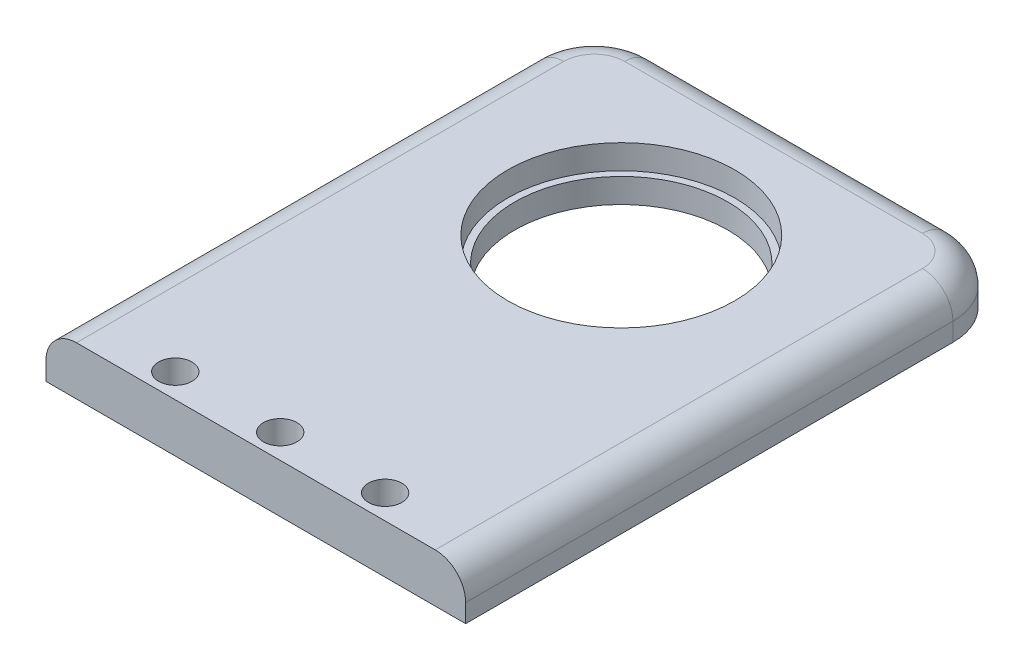
ISO-10303-21;
HEADER;
FILE_DESCRIPTION(('STEP AP214'),'2;1');
FILE_NAME('part.step','',(''),(''),'','','');
FILE_SCHEMA(('AUTOMOTIVE_DESIGN { 1 0 10303 214 1 1 1 1 }'));
ENDSEC;
DATA;
#1=APPLICATION_CONTEXT('core data for automotive mechanical design processes');
#2=APPLICATION_PROTOCOL_DEFINITION('international standard','automotive_design',2000,#1);
#3=PRODUCT_CONTEXT('',#1,'mechanical');
#4=PRODUCT('Part','Part','',(#3));
#5=PRODUCT_RELATED_PRODUCT_CATEGORY('part','',(#4));
#6=PRODUCT_DEFINITION_FORMATION('','',#4);
#7=PRODUCT_DEFINITION_CONTEXT('part definition',#1,'design');
#8=PRODUCT_DEFINITION('design','',#6,#7);
#9=PRODUCT_DEFINITION_SHAPE('','',#8);
#10=(LENGTH_UNIT() NAMED_UNIT(*) SI_UNIT(.MILLI.,.METRE.));
#11=(NAMED_UNIT(*) PLANE_ANGLE_UNIT() SI_UNIT($,.RADIAN.));
#12=(NAMED_UNIT(*) SI_UNIT($,.STERADIAN.) SOLID_ANGLE_UNIT());
#13=UNCERTAINTY_MEASURE_WITH_UNIT(LENGTH_MEASURE(1.E-05),#10,'distance_accuracy_value','');
#14=(GEOMETRIC_REPRESENTATION_CONTEXT(3) GLOBAL_UNCERTAINTY_ASSIGNED_CONTEXT((#13)) GLOBAL_UNIT_ASSIGNED_CONTEXT((#10,
#11,#12)) REPRESENTATION_CONTEXT('',''));
#15=CARTESIAN_POINT('',(0.,0.,0.));
#16=DIRECTION('',(0.,0.,1.));
#17=DIRECTION('',(1.,0.,0.));
#18=AXIS2_PLACEMENT_3D('',#15,#16,#17);
#19=CARTESIAN_POINT('',(0.722348923582215,8.,-20.));
#20=DIRECTION('',(0.,-1.,0.));
#21=DIRECTION('',(0.,0.,-1.));
#22=AXIS2_PLACEMENT_3D('',#19,#20,#21);
#23=CYLINDRICAL_SURFACE('',#22,18.63);
#24=CARTESIAN_POINT('',(0.722348923582215,8.,-20.));
#25=DIRECTION('',(0.,1.,0.));
#26=DIRECTION('',(0.,0.,1.));
#27=AXIS2_PLACEMENT_3D('',#24,#25,#26);
#28=CIRCLE('',#27,18.63);
#29=CARTESIAN_POINT('',(0.722348923582215,8.,-1.37));
#30=VERTEX_POINT('',#29);
#31=EDGE_CURVE('E140',#30,#30,#28,.T.);
#32=ORIENTED_EDGE('',*,*,#31,.T.);
#33=EDGE_LOOP('',(#32));
#34=FACE_BOUND('',#33,.T.);
#35=CARTESIAN_POINT('',(0.722348923582215,4.,-20.));
#36=DIRECTION('',(0.,-1.,0.));
#37=DIRECTION('',(0.,0.,-1.));
#38=AXIS2_PLACEMENT_3D('',#35,#36,#37);
#39=CIRCLE('',#38,18.63);
#40=CARTESIAN_POINT('',(0.722348923582215,4.,-38.63));
#41=VERTEX_POINT('',#40);
#42=EDGE_CURVE('E212',#41,#41,#39,.T.);
#43=ORIENTED_EDGE('',*,*,#42,.T.);
#44=EDGE_LOOP('',(#43));
#45=FACE_BOUND('',#44,.T.);
#46=ADVANCED_FACE('F47',(#34,#45),#23,.F.);
#47=CARTESIAN_POINT('',(0.,8.,0.));
#48=DIRECTION('',(0.,-1.,0.));
#49=DIRECTION('',(0.,0.,-1.));
#50=AXIS2_PLACEMENT_3D('',#47,#48,#49);
#51=PLANE('',#50);
#52=DIRECTION('',(1.,0.,0.));
#53=VECTOR('',#52,1.);
#54=CARTESIAN_POINT('',(-33.7276510764178,8.,40.));
#55=LINE('',#54,#53);
#56=CARTESIAN_POINT('',(-28.7276510764178,8.,40.));
#57=VERTEX_POINT('',#56);
#58=CARTESIAN_POINT('',(30.1723489235822,8.,40.));
#59=VERTEX_POINT('',#58);
#60=EDGE_CURVE('E157',#57,#59,#55,.T.);
#61=ORIENTED_EDGE('',*,*,#60,.T.);
#62=DIRECTION('',(0.,0.,-1.));
#63=VECTOR('',#62,1.);
#64=CARTESIAN_POINT('',(30.1723489235822,8.,0.));
#65=LINE('',#64,#63);
#66=CARTESIAN_POINT('',(30.1723489235822,8.,-40.));
#67=VERTEX_POINT('',#66);
#68=EDGE_CURVE('E190',#59,#67,#65,.T.);
#69=ORIENTED_EDGE('',*,*,#68,.T.);
#70=CARTESIAN_POINT('',(25.1723489235822,8.,-40.));
#71=DIRECTION('',(0.,-1.,0.));
#72=DIRECTION('',(0.,0.,-1.));
#73=AXIS2_PLACEMENT_3D('',#70,#71,#72);
#74=CIRCLE('',#73,5.);
#75=CARTESIAN_POINT('',(25.1723489235822,8.,-45.));
#76=VERTEX_POINT('',#75);
#77=EDGE_CURVE('E186',#67,#76,#74,.F.);
#78=ORIENTED_EDGE('',*,*,#77,.T.);
#79=DIRECTION('',(-1.,0.,0.));
#80=VECTOR('',#79,1.);
#81=CARTESIAN_POINT('',(0.,8.,-45.));
#82=LINE('',#81,#80);
#83=CARTESIAN_POINT('',(-23.7276510764178,8.,-45.));
#84=VERTEX_POINT('',#83);
#85=EDGE_CURVE('E183',#76,#84,#82,.T.);
#86=ORIENTED_EDGE('',*,*,#85,.T.);
#87=CARTESIAN_POINT('',(-23.7276510764178,8.,-40.));
#88=DIRECTION('',(0.,-1.,0.));
#89=DIRECTION('',(0.,0.,-1.));
#90=AXIS2_PLACEMENT_3D('',#87,#88,#89);
#91=CIRCLE('',#90,5.);
#92=CARTESIAN_POINT('',(-28.7276510764178,8.,-40.));
#93=VERTEX_POINT('',#92);
#94=EDGE_CURVE('E180',#84,#93,#91,.F.);
#95=ORIENTED_EDGE('',*,*,#94,.T.);
#96=DIRECTION('',(0.,0.,1.));
#97=VECTOR('',#96,1.);
#98=CARTESIAN_POINT('',(-28.7276510764178,8.,0.));
#99=LINE('',#98,#97);
#100=EDGE_CURVE('E177',#93,#57,#99,.T.);
#101=ORIENTED_EDGE('',*,*,#100,.T.);
#102=EDGE_LOOP('',(#61,#69,#78,#86,#95,#101));
#103=FACE_BOUND('',#102,.T.);
#104=ORIENTED_EDGE('',*,*,#31,.F.);
#105=EDGE_LOOP('',(#104));
#106=FACE_BOUND('',#105,.T.);
#107=CARTESIAN_POINT('',(0.722348923582222,8.,36.));
#108=DIRECTION('',(0.,1.,0.));
#109=DIRECTION('',(0.,0.,1.));
#110=AXIS2_PLACEMENT_3D('',#107,#108,#109);
#111=CIRCLE('',#110,2.75);
#112=CARTESIAN_POINT('',(0.722348923582222,8.,38.75));
#113=VERTEX_POINT('',#112);
#114=EDGE_CURVE('E249',#113,#113,#111,.T.);
#115=ORIENTED_EDGE('',*,*,#114,.F.);
#116=EDGE_LOOP('',(#115));
#117=FACE_BOUND('',#116,.T.);
#118=CARTESIAN_POINT('',(-16.5026510764178,8.,36.));
#119=DIRECTION('',(0.,1.,0.));
#120=DIRECTION('',(0.,0.,1.));
#121=AXIS2_PLACEMENT_3D('',#118,#119,#120);
#122=CIRCLE('',#121,2.75);
#123=CARTESIAN_POINT('',(-16.5026510764178,8.,38.75));
#124=VERTEX_POINT('',#123);
#125=EDGE_CURVE('E241',#124,#124,#122,.T.);
#126=ORIENTED_EDGE('',*,*,#125,.F.);
#127=EDGE_LOOP('',(#126));
#128=FACE_BOUND('',#127,.T.);
#129=CARTESIAN_POINT('',(17.9473489235822,8.,36.));
#130=DIRECTION('',(0.,1.,0.));
#131=DIRECTION('',(0.,0.,1.));
#132=AXIS2_PLACEMENT_3D('',#129,#130,#131);
#133=CIRCLE('',#132,2.75);
#134=CARTESIAN_POINT('',(17.9473489235822,8.,38.75));
#135=VERTEX_POINT('',#134);
#136=EDGE_CURVE('E231',#135,#135,#133,.T.);
#137=ORIENTED_EDGE('',*,*,#136,.F.);
#138=EDGE_LOOP('',(#137));
#139=FACE_BOUND('',#138,.T.);
#140=ADVANCED_FACE('F262',(#103,#106,#117,#128,#139),#51,.F.);
#141=CARTESIAN_POINT('',(0.,0.,0.));
#142=DIRECTION('',(0.,-1.,0.));
#143=DIRECTION('',(0.,0.,-1.));
#144=AXIS2_PLACEMENT_3D('',#141,#142,#143);
#145=PLANE('',#144);
#146=CARTESIAN_POINT('',(-16.5026510764178,0.,36.));
#147=DIRECTION('',(0.,1.,0.));
#148=DIRECTION('',(0.,0.,1.));
#149=AXIS2_PLACEMENT_3D('',#146,#147,#148);
#150=CIRCLE('',#149,2.75);
#151=CARTESIAN_POINT('',(-16.5026510764178,0.,38.75));
#152=VERTEX_POINT('',#151);
#153=EDGE_CURVE('E237',#152,#152,#150,.T.);
#154=ORIENTED_EDGE('',*,*,#153,.T.);
#155=EDGE_LOOP('',(#154));
#156=FACE_BOUND('',#155,.T.);
#157=DIRECTION('',(-1.,0.,0.));
#158=VECTOR('',#157,1.);
#159=CARTESIAN_POINT('',(-33.7276510764178,0.,-50.));
#160=LINE('',#159,#158);
#161=CARTESIAN_POINT('',(25.1723489235822,0.,-50.));
#162=VERTEX_POINT('',#161);
#163=CARTESIAN_POINT('',(-23.7276510764178,0.,-50.));
#164=VERTEX_POINT('',#163);
#165=EDGE_CURVE('E150',#162,#164,#160,.T.);
#166=ORIENTED_EDGE('',*,*,#165,.F.);
#167=CARTESIAN_POINT('',(25.1723489235822,0.,-40.));
#168=DIRECTION('',(0.,-1.,0.));
#169=DIRECTION('',(0.,0.,-1.));
#170=AXIS2_PLACEMENT_3D('',#167,#168,#169);
#171=CIRCLE('',#170,10.);
#172=CARTESIAN_POINT('',(35.1723489235822,0.,-40.));
#173=VERTEX_POINT('',#172);
#174=EDGE_CURVE('E169',#162,#173,#171,.T.);
#175=ORIENTED_EDGE('',*,*,#174,.T.);
#176=DIRECTION('',(0.,0.,-1.));
#177=VECTOR('',#176,1.);
#178=CARTESIAN_POINT('',(35.1723489235822,0.,40.));
#179=LINE('',#178,#177);
#180=CARTESIAN_POINT('',(35.1723489235822,0.,40.));
#181=VERTEX_POINT('',#180);
#182=EDGE_CURVE('E146',#181,#173,#179,.T.);
#183=ORIENTED_EDGE('',*,*,#182,.F.);
#184=DIRECTION('',(1.,0.,0.));
#185=VECTOR('',#184,1.);
#186=CARTESIAN_POINT('',(-33.7276510764178,0.,40.));
#187=LINE('',#186,#185);
#188=CARTESIAN_POINT('',(-33.7276510764178,0.,40.));
#189=VERTEX_POINT('',#188);
#190=EDGE_CURVE('E124',#189,#181,#187,.T.);
#191=ORIENTED_EDGE('',*,*,#190,.F.);
#192=DIRECTION('',(0.,0.,1.));
#193=VECTOR('',#192,1.);
#194=CARTESIAN_POINT('',(-33.7276510764178,0.,40.));
#195=LINE('',#194,#193);
#196=CARTESIAN_POINT('',(-33.7276510764178,0.,-40.));
#197=VERTEX_POINT('',#196);
#198=EDGE_CURVE('E133',#197,#189,#195,.T.);
#199=ORIENTED_EDGE('',*,*,#198,.F.);
#200=CARTESIAN_POINT('',(-23.7276510764178,0.,-40.));
#201=DIRECTION('',(0.,-1.,0.));
#202=DIRECTION('',(0.,0.,-1.));
#203=AXIS2_PLACEMENT_3D('',#200,#201,#202);
#204=CIRCLE('',#203,10.);
#205=EDGE_CURVE('E166',#197,#164,#204,.T.);
#206=ORIENTED_EDGE('',*,*,#205,.T.);
#207=EDGE_LOOP('',(#166,#175,#183,#191,#199,#206));
#208=FACE_BOUND('',#207,.T.);
#209=CARTESIAN_POINT('',(0.722348923582222,0.,36.));
#210=DIRECTION('',(0.,1.,0.));
#211=DIRECTION('',(0.,0.,1.));
#212=AXIS2_PLACEMENT_3D('',#209,#210,#211);
#213=CIRCLE('',#212,2.75);
#214=CARTESIAN_POINT('',(0.722348923582222,0.,38.75));
#215=VERTEX_POINT('',#214);
#216=EDGE_CURVE('E245',#215,#215,#213,.T.);
#217=ORIENTED_EDGE('',*,*,#216,.T.);
#218=EDGE_LOOP('',(#217));
#219=FACE_BOUND('',#218,.T.);
#220=CARTESIAN_POINT('',(17.9473489235822,0.,36.));
#221=DIRECTION('',(0.,1.,0.));
#222=DIRECTION('',(0.,0.,1.));
#223=AXIS2_PLACEMENT_3D('',#220,#221,#222);
#224=CIRCLE('',#223,2.75);
#225=CARTESIAN_POINT('',(17.9473489235822,0.,38.75));
#226=VERTEX_POINT('',#225);
#227=EDGE_CURVE('E224',#226,#226,#224,.T.);
#228=ORIENTED_EDGE('',*,*,#227,.T.);
#229=EDGE_LOOP('',(#228));
#230=FACE_BOUND('',#229,.T.);
#231=CARTESIAN_POINT('',(0.722348923582215,0.,-20.));
#232=DIRECTION('',(0.,-1.,0.));
#233=DIRECTION('',(0.,0.,-1.));
#234=AXIS2_PLACEMENT_3D('',#231,#232,#233);
#235=CIRCLE('',#234,17.5);
#236=CARTESIAN_POINT('',(0.722348923582215,0.,-37.5));
#237=VERTEX_POINT('',#236);
#238=EDGE_CURVE('E405',#237,#237,#235,.T.);
#239=ORIENTED_EDGE('',*,*,#238,.F.);
#240=EDGE_LOOP('',(#239));
#241=FACE_BOUND('',#240,.T.);
#242=ADVANCED_FACE('F143',(#156,#208,#219,#230,#241),#145,.T.);
#243=CARTESIAN_POINT('',(-33.7276510764178,8.,40.));
#244=DIRECTION('',(1.,0.,0.));
#245=DIRECTION('',(0.,0.,-1.));
#246=AXIS2_PLACEMENT_3D('',#243,#244,#245);
#247=PLANE('',#246);
#248=DIRECTION('',(0.,-1.,0.));
#249=VECTOR('',#248,1.);
#250=CARTESIAN_POINT('',(-33.7276510764178,8.,40.));
#251=LINE('',#250,#249);
#252=CARTESIAN_POINT('',(-33.7276510764178,3.,40.));
#253=VERTEX_POINT('',#252);
#254=EDGE_CURVE('E120',#253,#189,#251,.T.);
#255=ORIENTED_EDGE('',*,*,#254,.F.);
#256=DIRECTION('',(0.,0.,1.));
#257=VECTOR('',#256,1.);
#258=CARTESIAN_POINT('',(-33.7276510764178,3.,40.));
#259=LINE('',#258,#257);
#260=CARTESIAN_POINT('',(-33.7276510764178,3.,-40.));
#261=VERTEX_POINT('',#260);
#262=EDGE_CURVE('E11',#253,#261,#259,.F.);
#263=ORIENTED_EDGE('',*,*,#262,.T.);
#264=DIRECTION('',(0.,-1.,0.));
#265=VECTOR('',#264,1.);
#266=CARTESIAN_POINT('',(-33.7276510764178,8.,-40.));
#267=LINE('',#266,#265);
#268=EDGE_CURVE('E136',#261,#197,#267,.T.);
#269=ORIENTED_EDGE('',*,*,#268,.T.);
#270=ORIENTED_EDGE('',*,*,#198,.T.);
#271=EDGE_LOOP('',(#255,#263,#269,#270));
#272=FACE_BOUND('',#271,.T.);
#273=ADVANCED_FACE('F134',(#272),#247,.F.);
#274=CARTESIAN_POINT('',(-33.7276510764178,8.,40.));
#275=DIRECTION('',(0.,0.,-1.));
#276=DIRECTION('',(-1.,0.,0.));
#277=AXIS2_PLACEMENT_3D('',#274,#275,#276);
#278=PLANE('',#277);
#279=DIRECTION('',(0.,-1.,0.));
#280=VECTOR('',#279,1.);
#281=CARTESIAN_POINT('',(35.1723489235822,8.,40.));
#282=LINE('',#281,#280);
#283=CARTESIAN_POINT('',(35.1723489235822,3.,40.));
#284=VERTEX_POINT('',#283);
#285=EDGE_CURVE('E130',#284,#181,#282,.T.);
#286=ORIENTED_EDGE('',*,*,#285,.F.);
#287=CARTESIAN_POINT('',(30.1723489235822,3.,40.));
#288=DIRECTION('',(0.,0.,-1.));
#289=DIRECTION('',(-1.,0.,0.));
#290=AXIS2_PLACEMENT_3D('',#287,#288,#289);
#291=CIRCLE('',#290,5.);
#292=EDGE_CURVE('E57',#284,#59,#291,.F.);
#293=ORIENTED_EDGE('',*,*,#292,.T.);
#294=ORIENTED_EDGE('',*,*,#60,.F.);
#295=CARTESIAN_POINT('',(-28.7276510764178,3.,40.));
#296=DIRECTION('',(0.,0.,-1.));
#297=DIRECTION('',(-1.,0.,0.));
#298=AXIS2_PLACEMENT_3D('',#295,#296,#297);
#299=CIRCLE('',#298,5.);
#300=EDGE_CURVE('E65',#57,#253,#299,.F.);
#301=ORIENTED_EDGE('',*,*,#300,.T.);
#302=ORIENTED_EDGE('',*,*,#254,.T.);
#303=ORIENTED_EDGE('',*,*,#190,.T.);
#304=EDGE_LOOP('',(#286,#293,#294,#301,#302,#303));
#305=FACE_BOUND('',#304,.T.);
#306=ADVANCED_FACE('F122',(#305),#278,.F.);
#307=CARTESIAN_POINT('',(35.1723489235822,8.,40.));
#308=DIRECTION('',(-1.,0.,0.));
#309=DIRECTION('',(0.,0.,1.));
#310=AXIS2_PLACEMENT_3D('',#307,#308,#309);
#311=PLANE('',#310);
#312=DIRECTION('',(0.,-1.,0.));
#313=VECTOR('',#312,1.);
#314=CARTESIAN_POINT('',(35.1723489235822,8.,-40.));
#315=LINE('',#314,#313);
#316=CARTESIAN_POINT('',(35.1723489235822,3.,-40.));
#317=VERTEX_POINT('',#316);
#318=EDGE_CURVE('E172',#173,#317,#315,.F.);
#319=ORIENTED_EDGE('',*,*,#318,.T.);
#320=DIRECTION('',(0.,0.,-1.));
#321=VECTOR('',#320,1.);
#322=CARTESIAN_POINT('',(35.1723489235822,3.,40.));
#323=LINE('',#322,#321);
#324=EDGE_CURVE('E73',#317,#284,#323,.F.);
#325=ORIENTED_EDGE('',*,*,#324,.T.);
#326=ORIENTED_EDGE('',*,*,#285,.T.);
#327=ORIENTED_EDGE('',*,*,#182,.T.);
#328=EDGE_LOOP('',(#319,#325,#326,#327));
#329=FACE_BOUND('',#328,.T.);
#330=ADVANCED_FACE('F311',(#329),#311,.F.);
#331=CARTESIAN_POINT('',(-33.7276510764178,8.,-50.));
#332=DIRECTION('',(0.,0.,1.));
#333=DIRECTION('',(1.,0.,0.));
#334=AXIS2_PLACEMENT_3D('',#331,#332,#333);
#335=PLANE('',#334);
#336=DIRECTION('',(0.,-1.,0.));
#337=VECTOR('',#336,1.);
#338=CARTESIAN_POINT('',(-23.7276510764178,8.,-50.));
#339=LINE('',#338,#337);
#340=CARTESIAN_POINT('',(-23.7276510764178,3.,-50.));
#341=VERTEX_POINT('',#340);
#342=EDGE_CURVE('E129',#164,#341,#339,.F.);
#343=ORIENTED_EDGE('',*,*,#342,.T.);
#344=DIRECTION('',(-1.,0.,0.));
#345=VECTOR('',#344,1.);
#346=CARTESIAN_POINT('',(-33.7276510764178,3.,-50.));
#347=LINE('',#346,#345);
#348=CARTESIAN_POINT('',(25.1723489235822,3.,-50.));
#349=VERTEX_POINT('',#348);
#350=EDGE_CURVE('E196',#341,#349,#347,.F.);
#351=ORIENTED_EDGE('',*,*,#350,.T.);
#352=DIRECTION('',(0.,-1.,0.));
#353=VECTOR('',#352,1.);
#354=CARTESIAN_POINT('',(25.1723489235822,8.,-50.));
#355=LINE('',#354,#353);
#356=EDGE_CURVE('E163',#349,#162,#355,.T.);
#357=ORIENTED_EDGE('',*,*,#356,.T.);
#358=ORIENTED_EDGE('',*,*,#165,.T.);
#359=EDGE_LOOP('',(#343,#351,#357,#358));
#360=FACE_BOUND('',#359,.T.);
#361=ADVANCED_FACE('F278',(#360),#335,.F.);
#362=CARTESIAN_POINT('',(0.722348923582222,8.,36.));
#363=DIRECTION('',(0.,-1.,0.));
#364=DIRECTION('',(0.,0.,-1.));
#365=AXIS2_PLACEMENT_3D('',#362,#363,#364);
#366=CYLINDRICAL_SURFACE('',#365,2.75);
#367=ORIENTED_EDGE('',*,*,#114,.T.);
#368=EDGE_LOOP('',(#367));
#369=FACE_BOUND('',#368,.T.);
#370=ORIENTED_EDGE('',*,*,#216,.F.);
#371=EDGE_LOOP('',(#370));
#372=FACE_BOUND('',#371,.T.);
#373=ADVANCED_FACE('F304',(#369,#372),#366,.F.);
#374=CARTESIAN_POINT('',(-16.5026510764178,8.,36.));
#375=DIRECTION('',(0.,-1.,0.));
#376=DIRECTION('',(0.,0.,-1.));
#377=AXIS2_PLACEMENT_3D('',#374,#375,#376);
#378=CYLINDRICAL_SURFACE('',#377,2.75);
#379=ORIENTED_EDGE('',*,*,#125,.T.);
#380=EDGE_LOOP('',(#379));
#381=FACE_BOUND('',#380,.T.);
#382=ORIENTED_EDGE('',*,*,#153,.F.);
#383=EDGE_LOOP('',(#382));
#384=FACE_BOUND('',#383,.T.);
#385=ADVANCED_FACE('F382',(#381,#384),#378,.F.);
#386=CARTESIAN_POINT('',(17.9473489235822,8.,36.));
#387=DIRECTION('',(0.,-1.,0.));
#388=DIRECTION('',(0.,0.,-1.));
#389=AXIS2_PLACEMENT_3D('',#386,#387,#388);
#390=CYLINDRICAL_SURFACE('',#389,2.75);
#391=ORIENTED_EDGE('',*,*,#136,.T.);
#392=EDGE_LOOP('',(#391));
#393=FACE_BOUND('',#392,.T.);
#394=ORIENTED_EDGE('',*,*,#227,.F.);
#395=EDGE_LOOP('',(#394));
#396=FACE_BOUND('',#395,.T.);
#397=ADVANCED_FACE('F319',(#393,#396),#390,.F.);
#398=CARTESIAN_POINT('',(25.1723489235822,8.,-40.));
#399=DIRECTION('',(0.,-1.,0.));
#400=DIRECTION('',(0.,0.,-1.));
#401=AXIS2_PLACEMENT_3D('',#398,#399,#400);
#402=CYLINDRICAL_SURFACE('',#401,10.);
#403=ORIENTED_EDGE('',*,*,#356,.F.);
#404=CARTESIAN_POINT('',(25.1723489235822,3.,-40.));
#405=DIRECTION('',(0.,-1.,0.));
#406=DIRECTION('',(0.,0.,-1.));
#407=AXIS2_PLACEMENT_3D('',#404,#405,#406);
#408=CIRCLE('',#407,10.);
#409=EDGE_CURVE('E193',#349,#317,#408,.T.);
#410=ORIENTED_EDGE('',*,*,#409,.T.);
#411=ORIENTED_EDGE('',*,*,#318,.F.);
#412=ORIENTED_EDGE('',*,*,#174,.F.);
#413=EDGE_LOOP('',(#403,#410,#411,#412));
#414=FACE_BOUND('',#413,.T.);
#415=ADVANCED_FACE('F282',(#414),#402,.T.);
#416=CARTESIAN_POINT('',(-23.7276510764178,8.,-40.));
#417=DIRECTION('',(0.,-1.,0.));
#418=DIRECTION('',(0.,0.,-1.));
#419=AXIS2_PLACEMENT_3D('',#416,#417,#418);
#420=CYLINDRICAL_SURFACE('',#419,10.);
#421=ORIENTED_EDGE('',*,*,#268,.F.);
#422=CARTESIAN_POINT('',(-23.7276510764178,3.,-40.));
#423=DIRECTION('',(0.,-1.,0.));
#424=DIRECTION('',(0.,0.,-1.));
#425=AXIS2_PLACEMENT_3D('',#422,#423,#424);
#426=CIRCLE('',#425,10.);
#427=EDGE_CURVE('E199',#261,#341,#426,.T.);
#428=ORIENTED_EDGE('',*,*,#427,.T.);
#429=ORIENTED_EDGE('',*,*,#342,.F.);
#430=ORIENTED_EDGE('',*,*,#205,.F.);
#431=EDGE_LOOP('',(#421,#428,#429,#430));
#432=FACE_BOUND('',#431,.T.);
#433=ADVANCED_FACE('F285',(#432),#420,.T.);
#434=CARTESIAN_POINT('',(-28.7276510764178,3.,0.));
#435=DIRECTION('',(0.,0.,1.));
#436=DIRECTION('',(1.,0.,0.));
#437=AXIS2_PLACEMENT_3D('',#434,#435,#436);
#438=CYLINDRICAL_SURFACE('',#437,5.);
#439=ORIENTED_EDGE('',*,*,#300,.F.);
#440=ORIENTED_EDGE('',*,*,#100,.F.);
#441=CARTESIAN_POINT('',(-28.7276510764178,3.,-40.));
#442=DIRECTION('',(0.,0.,-1.));
#443=DIRECTION('',(-1.,0.,0.));
#444=AXIS2_PLACEMENT_3D('',#441,#442,#443);
#445=CIRCLE('',#444,5.);
#446=EDGE_CURVE('E51',#261,#93,#445,.T.);
#447=ORIENTED_EDGE('',*,*,#446,.F.);
#448=ORIENTED_EDGE('',*,*,#262,.F.);
#449=EDGE_LOOP('',(#439,#440,#447,#448));
#450=FACE_BOUND('',#449,.T.);
#451=ADVANCED_FACE('F49',(#450),#438,.T.);
#452=CARTESIAN_POINT('',(-23.7276510764178,3.,-40.));
#453=DIRECTION('',(0.,-1.,0.));
#454=DIRECTION('',(0.,0.,-1.));
#455=AXIS2_PLACEMENT_3D('',#452,#453,#454);
#456=DEGENERATE_TOROIDAL_SURFACE('',#455,5.,5.,.T.);
#457=ORIENTED_EDGE('',*,*,#446,.T.);
#458=ORIENTED_EDGE('',*,*,#94,.F.);
#459=CARTESIAN_POINT('',(-23.7276510764178,3.,-45.));
#460=DIRECTION('',(1.,0.,0.));
#461=DIRECTION('',(0.,0.,-1.));
#462=AXIS2_PLACEMENT_3D('',#459,#460,#461);
#463=CIRCLE('',#462,5.);
#464=EDGE_CURVE('E215',#341,#84,#463,.T.);
#465=ORIENTED_EDGE('',*,*,#464,.F.);
#466=ORIENTED_EDGE('',*,*,#427,.F.);
#467=EDGE_LOOP('',(#457,#458,#465,#466));
#468=FACE_BOUND('',#467,.T.);
#469=ADVANCED_FACE('F274',(#468),#456,.T.);
#470=CARTESIAN_POINT('',(30.1723489235822,3.,0.));
#471=DIRECTION('',(0.,0.,-1.));
#472=DIRECTION('',(-1.,0.,0.));
#473=AXIS2_PLACEMENT_3D('',#470,#471,#472);
#474=CYLINDRICAL_SURFACE('',#473,5.);
#475=ORIENTED_EDGE('',*,*,#292,.F.);
#476=ORIENTED_EDGE('',*,*,#324,.F.);
#477=CARTESIAN_POINT('',(30.1723489235822,3.,-40.));
#478=DIRECTION('',(0.,0.,-1.));
#479=DIRECTION('',(-1.,0.,0.));
#480=AXIS2_PLACEMENT_3D('',#477,#478,#479);
#481=CIRCLE('',#480,5.);
#482=EDGE_CURVE('E211',#67,#317,#481,.T.);
#483=ORIENTED_EDGE('',*,*,#482,.F.);
#484=ORIENTED_EDGE('',*,*,#68,.F.);
#485=EDGE_LOOP('',(#475,#476,#483,#484));
#486=FACE_BOUND('',#485,.T.);
#487=ADVANCED_FACE('F268',(#486),#474,.T.);
#488=CARTESIAN_POINT('',(0.,3.,-45.));
#489=DIRECTION('',(-1.,0.,0.));
#490=DIRECTION('',(0.,0.,1.));
#491=AXIS2_PLACEMENT_3D('',#488,#489,#490);
#492=CYLINDRICAL_SURFACE('',#491,5.);
#493=ORIENTED_EDGE('',*,*,#464,.T.);
#494=ORIENTED_EDGE('',*,*,#85,.F.);
#495=CARTESIAN_POINT('',(25.1723489235822,3.,-45.));
#496=DIRECTION('',(1.,0.,0.));
#497=DIRECTION('',(0.,0.,-1.));
#498=AXIS2_PLACEMENT_3D('',#495,#496,#497);
#499=CIRCLE('',#498,5.);
#500=EDGE_CURVE('E208',#349,#76,#499,.T.);
#501=ORIENTED_EDGE('',*,*,#500,.F.);
#502=ORIENTED_EDGE('',*,*,#350,.F.);
#503=EDGE_LOOP('',(#493,#494,#501,#502));
#504=FACE_BOUND('',#503,.T.);
#505=ADVANCED_FACE('F275',(#504),#492,.T.);
#506=CARTESIAN_POINT('',(25.1723489235822,3.,-40.));
#507=DIRECTION('',(0.,-1.,0.));
#508=DIRECTION('',(0.,0.,-1.));
#509=AXIS2_PLACEMENT_3D('',#506,#507,#508);
#510=DEGENERATE_TOROIDAL_SURFACE('',#509,5.,5.,.T.);
#511=ORIENTED_EDGE('',*,*,#482,.T.);
#512=ORIENTED_EDGE('',*,*,#409,.F.);
#513=ORIENTED_EDGE('',*,*,#500,.T.);
#514=ORIENTED_EDGE('',*,*,#77,.F.);
#515=EDGE_LOOP('',(#511,#512,#513,#514));
#516=FACE_BOUND('',#515,.T.);
#517=ADVANCED_FACE('F272',(#516),#510,.T.);
#518=CARTESIAN_POINT('',(0.722348923582215,4.,-20.));
#519=DIRECTION('',(0.,-1.,0.));
#520=DIRECTION('',(0.,0.,-1.));
#521=AXIS2_PLACEMENT_3D('',#518,#519,#520);
#522=PLANE('',#521);
#523=CARTESIAN_POINT('',(0.722348923582215,4.,-20.));
#524=DIRECTION('',(0.,-1.,0.));
#525=DIRECTION('',(0.,0.,-1.));
#526=AXIS2_PLACEMENT_3D('',#523,#524,#525);
#527=CIRCLE('',#526,17.5);
#528=CARTESIAN_POINT('',(0.722348923582215,4.,-37.5));
#529=VERTEX_POINT('',#528);
#530=EDGE_CURVE('E407',#529,#529,#527,.T.);
#531=ORIENTED_EDGE('',*,*,#530,.T.);
#532=EDGE_LOOP('',(#531));
#533=FACE_BOUND('',#532,.T.);
#534=ORIENTED_EDGE('',*,*,#42,.F.);
#535=EDGE_LOOP('',(#534));
#536=FACE_BOUND('',#535,.T.);
#537=ADVANCED_FACE('F322',(#533,#536),#522,.F.);
#538=CARTESIAN_POINT('',(0.722348923582215,4.,-20.));
#539=DIRECTION('',(0.,-1.,0.));
#540=DIRECTION('',(0.,0.,-1.));
#541=AXIS2_PLACEMENT_3D('',#538,#539,#540);
#542=CYLINDRICAL_SURFACE('',#541,17.5);
#543=ORIENTED_EDGE('',*,*,#530,.F.);
#544=EDGE_LOOP('',(#543));
#545=FACE_BOUND('',#544,.T.);
#546=ORIENTED_EDGE('',*,*,#238,.T.);
#547=EDGE_LOOP('',(#546));
#548=FACE_BOUND('',#547,.T.);
#549=ADVANCED_FACE('F365',(#545,#548),#542,.F.);
#550=CLOSED_SHELL('',(#46,#140,#242,#273,#306,#330,#361,#373,#385,#397,#415,#433,#451,#469,#487,
#505,#517,#537,#549));
#551=MANIFOLD_SOLID_BREP('B2',#550);
#552=ADVANCED_BREP_SHAPE_REPRESENTATION('',(#18,#551),#14);
#553=SHAPE_DEFINITION_REPRESENTATION(#9,#552);
ENDSEC;
END-ISO-10303-21;
